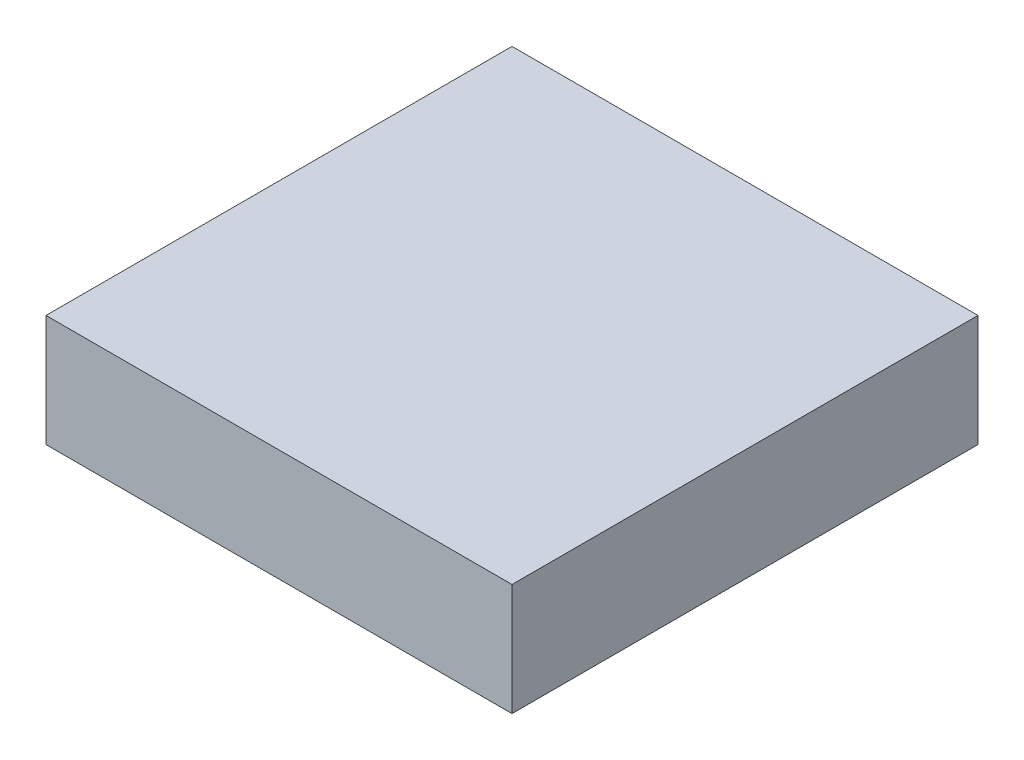
ISO-10303-21;
HEADER;
FILE_DESCRIPTION(('STEP AP214'),'2;1');
FILE_NAME('part.step','',(''),(''),'','','');
FILE_SCHEMA(('AUTOMOTIVE_DESIGN { 1 0 10303 214 1 1 1 1 }'));
ENDSEC;
DATA;
#1=APPLICATION_CONTEXT('core data for automotive mechanical design processes');
#2=APPLICATION_PROTOCOL_DEFINITION('international standard','automotive_design',2000,#1);
#3=PRODUCT_CONTEXT('',#1,'mechanical');
#4=PRODUCT('Part','Part','',(#3));
#5=PRODUCT_RELATED_PRODUCT_CATEGORY('part','',(#4));
#6=PRODUCT_DEFINITION_FORMATION('','',#4);
#7=PRODUCT_DEFINITION_CONTEXT('part definition',#1,'design');
#8=PRODUCT_DEFINITION('design','',#6,#7);
#9=PRODUCT_DEFINITION_SHAPE('','',#8);
#10=(LENGTH_UNIT() NAMED_UNIT(*) SI_UNIT(.MILLI.,.METRE.));
#11=(NAMED_UNIT(*) PLANE_ANGLE_UNIT() SI_UNIT($,.RADIAN.));
#12=(NAMED_UNIT(*) SI_UNIT($,.STERADIAN.) SOLID_ANGLE_UNIT());
#13=UNCERTAINTY_MEASURE_WITH_UNIT(LENGTH_MEASURE(1.E-05),#10,'distance_accuracy_value','');
#14=(GEOMETRIC_REPRESENTATION_CONTEXT(3) GLOBAL_UNCERTAINTY_ASSIGNED_CONTEXT((#13)) GLOBAL_UNIT_ASSIGNED_CONTEXT((#10,
#11,#12)) REPRESENTATION_CONTEXT('',''));
#15=CARTESIAN_POINT('',(0.,0.,0.));
#16=DIRECTION('',(0.,0.,1.));
#17=DIRECTION('',(1.,0.,0.));
#18=AXIS2_PLACEMENT_3D('',#15,#16,#17);
#19=CARTESIAN_POINT('',(0.,0.,-50.));
#20=DIRECTION('',(-1.,0.,0.));
#21=DIRECTION('',(0.,0.,1.));
#22=AXIS2_PLACEMENT_3D('',#19,#20,#21);
#23=PLANE('',#22);
#24=DIRECTION('',(0.,-1.,0.));
#25=VECTOR('',#24,1.);
#26=CARTESIAN_POINT('',(0.,0.,0.));
#27=LINE('',#26,#25);
#28=CARTESIAN_POINT('',(0.,12.,0.));
#29=VERTEX_POINT('',#28);
#30=CARTESIAN_POINT('',(0.,0.,0.));
#31=VERTEX_POINT('',#30);
#32=EDGE_CURVE('E101',#29,#31,#27,.T.);
#33=ORIENTED_EDGE('',*,*,#32,.F.);
#34=DIRECTION('',(0.,0.,1.));
#35=VECTOR('',#34,1.);
#36=CARTESIAN_POINT('',(0.,12.,-50.));
#37=LINE('',#36,#35);
#38=CARTESIAN_POINT('',(0.,12.,-50.));
#39=VERTEX_POINT('',#38);
#40=EDGE_CURVE('E11',#39,#29,#37,.T.);
#41=ORIENTED_EDGE('',*,*,#40,.F.);
#42=DIRECTION('',(0.,-1.,0.));
#43=VECTOR('',#42,1.);
#44=CARTESIAN_POINT('',(0.,0.,-50.));
#45=LINE('',#44,#43);
#46=CARTESIAN_POINT('',(0.,0.,-50.));
#47=VERTEX_POINT('',#46);
#48=EDGE_CURVE('E95',#39,#47,#45,.T.);
#49=ORIENTED_EDGE('',*,*,#48,.T.);
#50=DIRECTION('',(0.,0.,1.));
#51=VECTOR('',#50,1.);
#52=CARTESIAN_POINT('',(0.,0.,-50.));
#53=LINE('',#52,#51);
#54=EDGE_CURVE('E40',#47,#31,#53,.T.);
#55=ORIENTED_EDGE('',*,*,#54,.T.);
#56=EDGE_LOOP('',(#33,#41,#49,#55));
#57=FACE_BOUND('',#56,.T.);
#58=ADVANCED_FACE('F37',(#57),#23,.T.);
#59=CARTESIAN_POINT('',(0.,12.,-50.));
#60=DIRECTION('',(0.,1.,0.));
#61=DIRECTION('',(-1.,0.,0.));
#62=AXIS2_PLACEMENT_3D('',#59,#60,#61);
#63=PLANE('',#62);
#64=DIRECTION('',(-1.,0.,0.));
#65=VECTOR('',#64,1.);
#66=CARTESIAN_POINT('',(0.,12.,0.));
#67=LINE('',#66,#65);
#68=CARTESIAN_POINT('',(50.,12.,0.));
#69=VERTEX_POINT('',#68);
#70=EDGE_CURVE('E97',#69,#29,#67,.T.);
#71=ORIENTED_EDGE('',*,*,#70,.F.);
#72=DIRECTION('',(0.,0.,1.));
#73=VECTOR('',#72,1.);
#74=CARTESIAN_POINT('',(50.,12.,-50.));
#75=LINE('',#74,#73);
#76=CARTESIAN_POINT('',(50.,12.,-50.));
#77=VERTEX_POINT('',#76);
#78=EDGE_CURVE('E46',#77,#69,#75,.T.);
#79=ORIENTED_EDGE('',*,*,#78,.F.);
#80=DIRECTION('',(-1.,0.,0.));
#81=VECTOR('',#80,1.);
#82=CARTESIAN_POINT('',(0.,12.,-50.));
#83=LINE('',#82,#81);
#84=EDGE_CURVE('E92',#77,#39,#83,.T.);
#85=ORIENTED_EDGE('',*,*,#84,.T.);
#86=ORIENTED_EDGE('',*,*,#40,.T.);
#87=EDGE_LOOP('',(#71,#79,#85,#86));
#88=FACE_BOUND('',#87,.T.);
#89=ADVANCED_FACE('F111',(#88),#63,.T.);
#90=CARTESIAN_POINT('',(50.,0.,-50.));
#91=DIRECTION('',(1.,0.,0.));
#92=DIRECTION('',(0.,0.,-1.));
#93=AXIS2_PLACEMENT_3D('',#90,#91,#92);
#94=PLANE('',#93);
#95=DIRECTION('',(0.,1.,0.));
#96=VECTOR('',#95,1.);
#97=CARTESIAN_POINT('',(50.,0.,0.));
#98=LINE('',#97,#96);
#99=CARTESIAN_POINT('',(50.,0.,0.));
#100=VERTEX_POINT('',#99);
#101=EDGE_CURVE('E87',#100,#69,#98,.T.);
#102=ORIENTED_EDGE('',*,*,#101,.F.);
#103=DIRECTION('',(0.,0.,1.));
#104=VECTOR('',#103,1.);
#105=CARTESIAN_POINT('',(50.,0.,-50.));
#106=LINE('',#105,#104);
#107=CARTESIAN_POINT('',(50.,0.,-50.));
#108=VERTEX_POINT('',#107);
#109=EDGE_CURVE('E82',#108,#100,#106,.T.);
#110=ORIENTED_EDGE('',*,*,#109,.F.);
#111=DIRECTION('',(0.,1.,0.));
#112=VECTOR('',#111,1.);
#113=CARTESIAN_POINT('',(50.,0.,-50.));
#114=LINE('',#113,#112);
#115=EDGE_CURVE('E85',#108,#77,#114,.T.);
#116=ORIENTED_EDGE('',*,*,#115,.T.);
#117=ORIENTED_EDGE('',*,*,#78,.T.);
#118=EDGE_LOOP('',(#102,#110,#116,#117));
#119=FACE_BOUND('',#118,.T.);
#120=ADVANCED_FACE('F84',(#119),#94,.T.);
#121=CARTESIAN_POINT('',(0.,0.,-50.));
#122=DIRECTION('',(0.,-1.,0.));
#123=DIRECTION('',(1.,0.,0.));
#124=AXIS2_PLACEMENT_3D('',#121,#122,#123);
#125=PLANE('',#124);
#126=DIRECTION('',(1.,0.,0.));
#127=VECTOR('',#126,1.);
#128=CARTESIAN_POINT('',(0.,0.,0.));
#129=LINE('',#128,#127);
#130=EDGE_CURVE('E104',#31,#100,#129,.T.);
#131=ORIENTED_EDGE('',*,*,#130,.F.);
#132=ORIENTED_EDGE('',*,*,#54,.F.);
#133=DIRECTION('',(1.,0.,0.));
#134=VECTOR('',#133,1.);
#135=CARTESIAN_POINT('',(0.,0.,-50.));
#136=LINE('',#135,#134);
#137=EDGE_CURVE('E91',#47,#108,#136,.T.);
#138=ORIENTED_EDGE('',*,*,#137,.T.);
#139=ORIENTED_EDGE('',*,*,#109,.T.);
#140=EDGE_LOOP('',(#131,#132,#138,#139));
#141=FACE_BOUND('',#140,.T.);
#142=ADVANCED_FACE('F94',(#141),#125,.T.);
#143=CARTESIAN_POINT('',(0.,12.,-50.));
#144=DIRECTION('',(0.,0.,-1.));
#145=DIRECTION('',(-1.,0.,0.));
#146=AXIS2_PLACEMENT_3D('',#143,#144,#145);
#147=PLANE('',#146);
#148=ORIENTED_EDGE('',*,*,#48,.F.);
#149=ORIENTED_EDGE('',*,*,#84,.F.);
#150=ORIENTED_EDGE('',*,*,#115,.F.);
#151=ORIENTED_EDGE('',*,*,#137,.F.);
#152=EDGE_LOOP('',(#148,#149,#150,#151));
#153=FACE_BOUND('',#152,.T.);
#154=ADVANCED_FACE('F90',(#153),#147,.T.);
#155=CARTESIAN_POINT('',(0.,12.,0.));
#156=DIRECTION('',(0.,0.,-1.));
#157=DIRECTION('',(-1.,0.,0.));
#158=AXIS2_PLACEMENT_3D('',#155,#156,#157);
#159=PLANE('',#158);
#160=ORIENTED_EDGE('',*,*,#32,.T.);
#161=ORIENTED_EDGE('',*,*,#130,.T.);
#162=ORIENTED_EDGE('',*,*,#101,.T.);
#163=ORIENTED_EDGE('',*,*,#70,.T.);
#164=EDGE_LOOP('',(#160,#161,#162,#163));
#165=FACE_BOUND('',#164,.T.);
#166=ADVANCED_FACE('F110',(#165),#159,.F.);
#167=CLOSED_SHELL('',(#58,#89,#120,#142,#154,#166));
#168=MANIFOLD_SOLID_BREP('B2',#167);
#169=ADVANCED_BREP_SHAPE_REPRESENTATION('',(#18,#168),#14);
#170=SHAPE_DEFINITION_REPRESENTATION(#9,#169);
ENDSEC;
END-ISO-10303-21;
